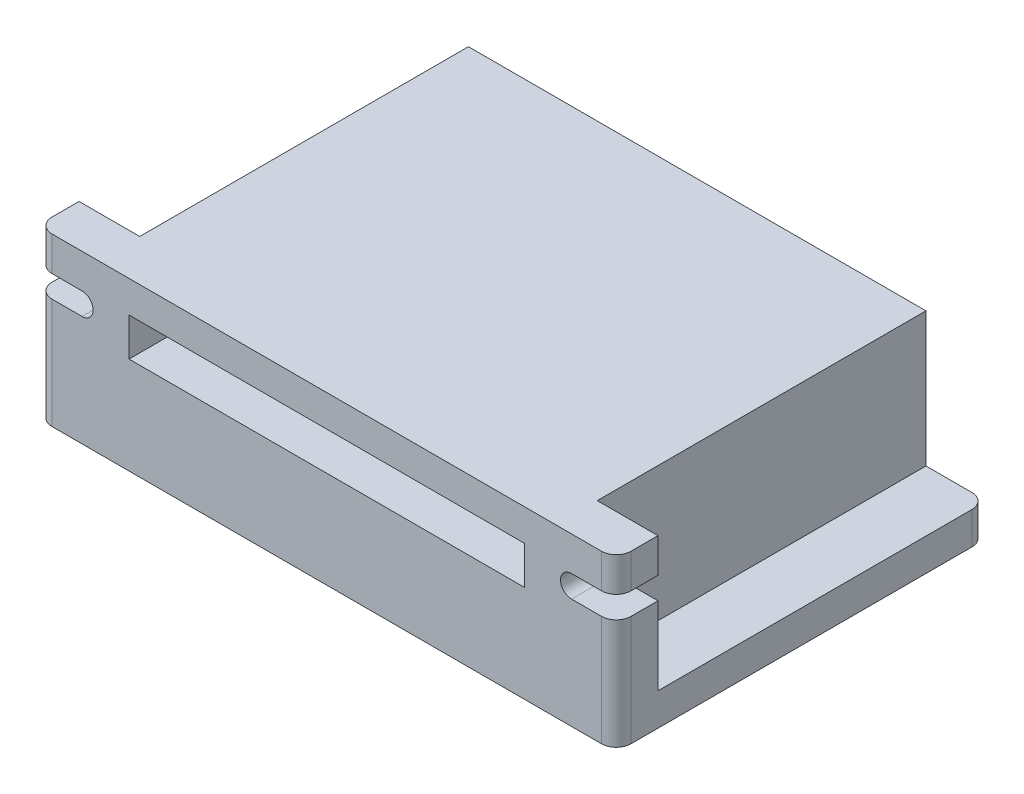
ISO-10303-21;
HEADER;
FILE_DESCRIPTION(('STEP AP214'),'2;1');
FILE_NAME('part.step','',(''),(''),'','','');
FILE_SCHEMA(('AUTOMOTIVE_DESIGN { 1 0 10303 214 1 1 1 1 }'));
ENDSEC;
DATA;
#1=APPLICATION_CONTEXT('core data for automotive mechanical design processes');
#2=APPLICATION_PROTOCOL_DEFINITION('international standard','automotive_design',2000,#1);
#3=PRODUCT_CONTEXT('',#1,'mechanical');
#4=PRODUCT('Part','Part','',(#3));
#5=PRODUCT_RELATED_PRODUCT_CATEGORY('part','',(#4));
#6=PRODUCT_DEFINITION_FORMATION('','',#4);
#7=PRODUCT_DEFINITION_CONTEXT('part definition',#1,'design');
#8=PRODUCT_DEFINITION('design','',#6,#7);
#9=PRODUCT_DEFINITION_SHAPE('','',#8);
#10=(LENGTH_UNIT() NAMED_UNIT(*) SI_UNIT(.MILLI.,.METRE.));
#11=(NAMED_UNIT(*) PLANE_ANGLE_UNIT() SI_UNIT($,.RADIAN.));
#12=(NAMED_UNIT(*) SI_UNIT($,.STERADIAN.) SOLID_ANGLE_UNIT());
#13=UNCERTAINTY_MEASURE_WITH_UNIT(LENGTH_MEASURE(1.E-05),#10,'distance_accuracy_value','');
#14=(GEOMETRIC_REPRESENTATION_CONTEXT(3) GLOBAL_UNCERTAINTY_ASSIGNED_CONTEXT((#13)) GLOBAL_UNIT_ASSIGNED_CONTEXT((#10,
#11,#12)) REPRESENTATION_CONTEXT('',''));
#15=CARTESIAN_POINT('',(0.,0.,0.));
#16=DIRECTION('',(0.,0.,1.));
#17=DIRECTION('',(1.,0.,0.));
#18=AXIS2_PLACEMENT_3D('',#15,#16,#17);
#19=CARTESIAN_POINT('',(-56.,34.,-34.75));
#20=DIRECTION('',(0.,-1.,0.));
#21=DIRECTION('',(0.,0.,-1.));
#22=AXIS2_PLACEMENT_3D('',#19,#20,#21);
#23=CYLINDRICAL_SURFACE('',#22,3.);
#24=CARTESIAN_POINT('',(-56.,6.61575280406623,-34.75));
#25=DIRECTION('',(0.,1.,0.));
#26=DIRECTION('',(0.,0.,1.));
#27=AXIS2_PLACEMENT_3D('',#24,#25,#26);
#28=CIRCLE('',#27,3.);
#29=CARTESIAN_POINT('',(-56.,6.61575280406623,-37.75));
#30=VERTEX_POINT('',#29);
#31=CARTESIAN_POINT('',(-59.,6.61575280406623,-34.75));
#32=VERTEX_POINT('',#31);
#33=EDGE_CURVE('E277',#30,#32,#28,.T.);
#34=ORIENTED_EDGE('',*,*,#33,.F.);
#35=DIRECTION('',(0.,-1.,0.));
#36=VECTOR('',#35,1.);
#37=CARTESIAN_POINT('',(-56.,34.,-37.75));
#38=LINE('',#37,#36);
#39=CARTESIAN_POINT('',(-56.,0.,-37.75));
#40=VERTEX_POINT('',#39);
#41=EDGE_CURVE('E361',#30,#40,#38,.T.);
#42=ORIENTED_EDGE('',*,*,#41,.T.);
#43=CARTESIAN_POINT('',(-56.,0.,-34.75));
#44=DIRECTION('',(0.,1.,0.));
#45=DIRECTION('',(0.,0.,-1.));
#46=AXIS2_PLACEMENT_3D('',#43,#44,#45);
#47=CIRCLE('',#46,3.);
#48=CARTESIAN_POINT('',(-59.,0.,-34.75));
#49=VERTEX_POINT('',#48);
#50=EDGE_CURVE('E345',#40,#49,#47,.T.);
#51=ORIENTED_EDGE('',*,*,#50,.T.);
#52=DIRECTION('',(0.,-1.,0.));
#53=VECTOR('',#52,1.);
#54=CARTESIAN_POINT('',(-59.,34.,-34.75));
#55=LINE('',#54,#53);
#56=EDGE_CURVE('E405',#32,#49,#55,.T.);
#57=ORIENTED_EDGE('',*,*,#56,.F.);
#58=EDGE_LOOP('',(#34,#42,#51,#57));
#59=FACE_BOUND('',#58,.T.);
#60=ADVANCED_FACE('F33',(#59),#23,.T.);
#61=CARTESIAN_POINT('',(-59.,34.,34.75));
#62=DIRECTION('',(1.,0.,0.));
#63=DIRECTION('',(0.,0.,-1.));
#64=AXIS2_PLACEMENT_3D('',#61,#62,#63);
#65=PLANE('',#64);
#66=DIRECTION('',(0.,0.,1.));
#67=VECTOR('',#66,1.);
#68=CARTESIAN_POINT('',(-59.,6.61575280406623,34.75));
#69=LINE('',#68,#67);
#70=CARTESIAN_POINT('',(-59.,6.61575280406623,29.25));
#71=VERTEX_POINT('',#70);
#72=EDGE_CURVE('E275',#32,#71,#69,.T.);
#73=ORIENTED_EDGE('',*,*,#72,.F.);
#74=ORIENTED_EDGE('',*,*,#56,.T.);
#75=DIRECTION('',(0.,0.,1.));
#76=VECTOR('',#75,1.);
#77=CARTESIAN_POINT('',(-59.,0.,34.75));
#78=LINE('',#77,#76);
#79=CARTESIAN_POINT('',(-59.,0.,34.75));
#80=VERTEX_POINT('',#79);
#81=EDGE_CURVE('E364',#49,#80,#78,.T.);
#82=ORIENTED_EDGE('',*,*,#81,.T.);
#83=DIRECTION('',(0.,-1.,0.));
#84=VECTOR('',#83,1.);
#85=CARTESIAN_POINT('',(-59.,34.,34.75));
#86=LINE('',#85,#84);
#87=CARTESIAN_POINT('',(-59.,22.5,34.75));
#88=VERTEX_POINT('',#87);
#89=EDGE_CURVE('E401',#88,#80,#86,.T.);
#90=ORIENTED_EDGE('',*,*,#89,.F.);
#91=DIRECTION('',(0.,0.,-1.));
#92=VECTOR('',#91,1.);
#93=CARTESIAN_POINT('',(-59.,22.5,34.75));
#94=LINE('',#93,#92);
#95=CARTESIAN_POINT('',(-59.,22.5,29.25));
#96=VERTEX_POINT('',#95);
#97=EDGE_CURVE('E337',#88,#96,#94,.T.);
#98=ORIENTED_EDGE('',*,*,#97,.T.);
#99=DIRECTION('',(0.,1.,0.));
#100=VECTOR('',#99,1.);
#101=CARTESIAN_POINT('',(-59.,34.,29.25));
#102=LINE('',#101,#100);
#103=EDGE_CURVE('E272',#71,#96,#102,.T.);
#104=ORIENTED_EDGE('',*,*,#103,.F.);
#105=EDGE_LOOP('',(#73,#74,#82,#90,#98,#104));
#106=FACE_BOUND('',#105,.T.);
#107=ADVANCED_FACE('F468',(#106),#65,.F.);
#108=CARTESIAN_POINT('',(-59.,27.,29.25));
#109=VERTEX_POINT('',#108);
#110=CARTESIAN_POINT('',(-59.,34.,29.25));
#111=VERTEX_POINT('',#110);
#112=EDGE_CURVE('E270',#109,#111,#102,.T.);
#113=ORIENTED_EDGE('',*,*,#112,.F.);
#114=DIRECTION('',(0.,0.,1.));
#115=VECTOR('',#114,1.);
#116=CARTESIAN_POINT('',(-59.,27.,34.75));
#117=LINE('',#116,#115);
#118=CARTESIAN_POINT('',(-59.,27.,34.75));
#119=VERTEX_POINT('',#118);
#120=EDGE_CURVE('E343',#109,#119,#117,.T.);
#121=ORIENTED_EDGE('',*,*,#120,.T.);
#122=CARTESIAN_POINT('',(-59.,34.,34.75));
#123=VERTEX_POINT('',#122);
#124=EDGE_CURVE('E402',#123,#119,#86,.T.);
#125=ORIENTED_EDGE('',*,*,#124,.F.);
#126=DIRECTION('',(0.,0.,1.));
#127=VECTOR('',#126,1.);
#128=CARTESIAN_POINT('',(-59.,34.,34.75));
#129=LINE('',#128,#127);
#130=EDGE_CURVE('E346',#111,#123,#129,.T.);
#131=ORIENTED_EDGE('',*,*,#130,.F.);
#132=EDGE_LOOP('',(#113,#121,#125,#131));
#133=FACE_BOUND('',#132,.T.);
#134=ADVANCED_FACE('F444',(#133),#65,.F.);
#135=CARTESIAN_POINT('',(-56.,34.,-37.75));
#136=DIRECTION('',(0.,0.,1.));
#137=DIRECTION('',(1.,0.,0.));
#138=AXIS2_PLACEMENT_3D('',#135,#136,#137);
#139=PLANE('',#138);
#140=DIRECTION('',(1.,0.,0.));
#141=VECTOR('',#140,1.);
#142=CARTESIAN_POINT('',(-66.0825163790406,6.61575280406623,-37.75));
#143=LINE('',#142,#141);
#144=CARTESIAN_POINT('',(-46.6299205781127,6.61575280406623,-37.75));
#145=VERTEX_POINT('',#144);
#146=EDGE_CURVE('E259',#30,#145,#143,.T.);
#147=ORIENTED_EDGE('',*,*,#146,.T.);
#148=DIRECTION('',(0.,1.,0.));
#149=VECTOR('',#148,1.);
#150=CARTESIAN_POINT('',(-46.6299205781127,6.61575280406623,-37.75));
#151=LINE('',#150,#149);
#152=CARTESIAN_POINT('',(-46.6299205781127,34.,-37.75));
#153=VERTEX_POINT('',#152);
#154=EDGE_CURVE('E251',#145,#153,#151,.T.);
#155=ORIENTED_EDGE('',*,*,#154,.T.);
#156=DIRECTION('',(-1.,0.,0.));
#157=VECTOR('',#156,1.);
#158=CARTESIAN_POINT('',(-56.,34.,-37.75));
#159=LINE('',#158,#157);
#160=CARTESIAN_POINT('',(46.6299205781127,34.,-37.75));
#161=VERTEX_POINT('',#160);
#162=EDGE_CURVE('E358',#161,#153,#159,.T.);
#163=ORIENTED_EDGE('',*,*,#162,.F.);
#164=DIRECTION('',(0.,1.,0.));
#165=VECTOR('',#164,1.);
#166=CARTESIAN_POINT('',(46.6299205781127,6.61575280406623,-37.75));
#167=LINE('',#166,#165);
#168=CARTESIAN_POINT('',(46.6299205781127,6.61575280406623,-37.75));
#169=VERTEX_POINT('',#168);
#170=EDGE_CURVE('E283',#169,#161,#167,.T.);
#171=ORIENTED_EDGE('',*,*,#170,.F.);
#172=DIRECTION('',(-1.,0.,0.));
#173=VECTOR('',#172,1.);
#174=CARTESIAN_POINT('',(66.0825163790406,6.61575280406623,-37.75));
#175=LINE('',#174,#173);
#176=CARTESIAN_POINT('',(56.,6.61575280406623,-37.75));
#177=VERTEX_POINT('',#176);
#178=EDGE_CURVE('E279',#177,#169,#175,.T.);
#179=ORIENTED_EDGE('',*,*,#178,.F.);
#180=DIRECTION('',(0.,-1.,0.));
#181=VECTOR('',#180,1.);
#182=CARTESIAN_POINT('',(56.,34.,-37.75));
#183=LINE('',#182,#181);
#184=CARTESIAN_POINT('',(56.,0.,-37.75));
#185=VERTEX_POINT('',#184);
#186=EDGE_CURVE('E385',#177,#185,#183,.T.);
#187=ORIENTED_EDGE('',*,*,#186,.T.);
#188=DIRECTION('',(-1.,0.,0.));
#189=VECTOR('',#188,1.);
#190=CARTESIAN_POINT('',(-56.,0.,-37.75));
#191=LINE('',#190,#189);
#192=EDGE_CURVE('E349',#185,#40,#191,.T.);
#193=ORIENTED_EDGE('',*,*,#192,.T.);
#194=ORIENTED_EDGE('',*,*,#41,.F.);
#195=EDGE_LOOP('',(#147,#155,#163,#171,#179,#187,#193,#194));
#196=FACE_BOUND('',#195,.T.);
#197=ADVANCED_FACE('F456',(#196),#139,.F.);
#198=CARTESIAN_POINT('',(-56.,34.,-34.75));
#199=DIRECTION('',(0.,-1.,0.));
#200=DIRECTION('',(0.,0.,-1.));
#201=AXIS2_PLACEMENT_3D('',#198,#199,#200);
#202=PLANE('',#201);
#203=DIRECTION('',(0.,0.,-1.));
#204=VECTOR('',#203,1.);
#205=CARTESIAN_POINT('',(-46.6299205781127,34.,-34.75));
#206=LINE('',#205,#204);
#207=CARTESIAN_POINT('',(-46.6299205781127,34.,29.25));
#208=VERTEX_POINT('',#207);
#209=EDGE_CURVE('E11',#208,#153,#206,.T.);
#210=ORIENTED_EDGE('',*,*,#209,.F.);
#211=DIRECTION('',(1.,0.,0.));
#212=VECTOR('',#211,1.);
#213=CARTESIAN_POINT('',(-56.,34.,29.25));
#214=LINE('',#213,#212);
#215=EDGE_CURVE('E273',#111,#208,#214,.T.);
#216=ORIENTED_EDGE('',*,*,#215,.F.);
#217=ORIENTED_EDGE('',*,*,#130,.T.);
#218=CARTESIAN_POINT('',(-56.,34.,34.75));
#219=DIRECTION('',(0.,1.,0.));
#220=DIRECTION('',(0.,0.,-1.));
#221=AXIS2_PLACEMENT_3D('',#218,#219,#220);
#222=CIRCLE('',#221,3.);
#223=CARTESIAN_POINT('',(-56.,34.,37.75));
#224=VERTEX_POINT('',#223);
#225=EDGE_CURVE('E348',#123,#224,#222,.T.);
#226=ORIENTED_EDGE('',*,*,#225,.T.);
#227=DIRECTION('',(1.,0.,0.));
#228=VECTOR('',#227,1.);
#229=CARTESIAN_POINT('',(-56.,34.,37.75));
#230=LINE('',#229,#228);
#231=CARTESIAN_POINT('',(56.,34.,37.75));
#232=VERTEX_POINT('',#231);
#233=EDGE_CURVE('E351',#224,#232,#230,.T.);
#234=ORIENTED_EDGE('',*,*,#233,.T.);
#235=CARTESIAN_POINT('',(56.,34.,34.75));
#236=DIRECTION('',(0.,1.,0.));
#237=DIRECTION('',(0.,0.,-1.));
#238=AXIS2_PLACEMENT_3D('',#235,#236,#237);
#239=CIRCLE('',#238,3.);
#240=CARTESIAN_POINT('',(59.,34.,34.75));
#241=VERTEX_POINT('',#240);
#242=EDGE_CURVE('E353',#232,#241,#239,.T.);
#243=ORIENTED_EDGE('',*,*,#242,.T.);
#244=DIRECTION('',(0.,0.,-1.));
#245=VECTOR('',#244,1.);
#246=CARTESIAN_POINT('',(59.,34.,34.75));
#247=LINE('',#246,#245);
#248=CARTESIAN_POINT('',(59.,34.,29.25));
#249=VERTEX_POINT('',#248);
#250=EDGE_CURVE('E355',#241,#249,#247,.T.);
#251=ORIENTED_EDGE('',*,*,#250,.T.);
#252=DIRECTION('',(1.,0.,0.));
#253=VECTOR('',#252,1.);
#254=CARTESIAN_POINT('',(-56.,34.,29.25));
#255=LINE('',#254,#253);
#256=CARTESIAN_POINT('',(46.6299205781127,34.,29.25));
#257=VERTEX_POINT('',#256);
#258=EDGE_CURVE('E300',#257,#249,#255,.T.);
#259=ORIENTED_EDGE('',*,*,#258,.F.);
#260=DIRECTION('',(0.,0.,-1.));
#261=VECTOR('',#260,1.);
#262=CARTESIAN_POINT('',(46.6299205781127,34.,-34.75));
#263=LINE('',#262,#261);
#264=EDGE_CURVE('E418',#257,#161,#263,.T.);
#265=ORIENTED_EDGE('',*,*,#264,.T.);
#266=ORIENTED_EDGE('',*,*,#162,.T.);
#267=EDGE_LOOP('',(#210,#216,#217,#226,#234,#243,#251,#259,#265,#266));
#268=FACE_BOUND('',#267,.T.);
#269=ADVANCED_FACE('F449',(#268),#202,.F.);
#270=CARTESIAN_POINT('',(-72.0827207811336,27.,3.74999999999999));
#271=DIRECTION('',(0.,1.,0.));
#272=DIRECTION('',(0.,0.,1.));
#273=AXIS2_PLACEMENT_3D('',#270,#271,#272);
#274=PLANE('',#273);
#275=DIRECTION('',(-1.,0.,0.));
#276=VECTOR('',#275,1.);
#277=CARTESIAN_POINT('',(-72.0827207811336,27.,29.25));
#278=LINE('',#277,#276);
#279=CARTESIAN_POINT('',(-49.8883465046181,27.,29.25));
#280=VERTEX_POINT('',#279);
#281=EDGE_CURVE('E268',#280,#109,#278,.T.);
#282=ORIENTED_EDGE('',*,*,#281,.F.);
#283=DIRECTION('',(0.,0.,1.));
#284=VECTOR('',#283,1.);
#285=CARTESIAN_POINT('',(-49.8883465046181,27.,3.74999999999999));
#286=LINE('',#285,#284);
#287=CARTESIAN_POINT('',(-49.8883465046181,27.,37.75));
#288=VERTEX_POINT('',#287);
#289=EDGE_CURVE('E331',#280,#288,#286,.T.);
#290=ORIENTED_EDGE('',*,*,#289,.T.);
#291=DIRECTION('',(-1.,0.,0.));
#292=VECTOR('',#291,1.);
#293=CARTESIAN_POINT('',(-72.0827207811336,27.,37.75));
#294=LINE('',#293,#292);
#295=CARTESIAN_POINT('',(-56.,27.,37.75));
#296=VERTEX_POINT('',#295);
#297=EDGE_CURVE('E328',#288,#296,#294,.T.);
#298=ORIENTED_EDGE('',*,*,#297,.T.);
#299=CARTESIAN_POINT('',(-56.,27.,34.75));
#300=DIRECTION('',(0.,1.,0.));
#301=DIRECTION('',(0.,0.,1.));
#302=AXIS2_PLACEMENT_3D('',#299,#300,#301);
#303=CIRCLE('',#302,3.);
#304=EDGE_CURVE('E340',#119,#296,#303,.T.);
#305=ORIENTED_EDGE('',*,*,#304,.F.);
#306=ORIENTED_EDGE('',*,*,#120,.F.);
#307=EDGE_LOOP('',(#282,#290,#298,#305,#306));
#308=FACE_BOUND('',#307,.T.);
#309=ADVANCED_FACE('F428',(#308),#274,.F.);
#310=CARTESIAN_POINT('',(-72.0827207811336,22.5,3.74999999999999));
#311=DIRECTION('',(0.,-1.,0.));
#312=DIRECTION('',(0.,0.,-1.));
#313=AXIS2_PLACEMENT_3D('',#310,#311,#312);
#314=PLANE('',#313);
#315=DIRECTION('',(1.,0.,0.));
#316=VECTOR('',#315,1.);
#317=CARTESIAN_POINT('',(-72.0827207811336,22.5,29.25));
#318=LINE('',#317,#316);
#319=CARTESIAN_POINT('',(-49.8883465046181,22.5,29.25));
#320=VERTEX_POINT('',#319);
#321=EDGE_CURVE('E55',#96,#320,#318,.T.);
#322=ORIENTED_EDGE('',*,*,#321,.F.);
#323=ORIENTED_EDGE('',*,*,#97,.F.);
#324=CARTESIAN_POINT('',(-56.,22.5,34.75));
#325=DIRECTION('',(0.,-1.,0.));
#326=DIRECTION('',(0.,0.,-1.));
#327=AXIS2_PLACEMENT_3D('',#324,#325,#326);
#328=CIRCLE('',#327,3.);
#329=CARTESIAN_POINT('',(-56.,22.5,37.75));
#330=VERTEX_POINT('',#329);
#331=EDGE_CURVE('E333',#330,#88,#328,.T.);
#332=ORIENTED_EDGE('',*,*,#331,.F.);
#333=DIRECTION('',(-1.,0.,0.));
#334=VECTOR('',#333,1.);
#335=CARTESIAN_POINT('',(-56.,22.5,37.75));
#336=LINE('',#335,#334);
#337=CARTESIAN_POINT('',(-49.8883465046181,22.5,37.75));
#338=VERTEX_POINT('',#337);
#339=EDGE_CURVE('E407',#338,#330,#336,.T.);
#340=ORIENTED_EDGE('',*,*,#339,.F.);
#341=DIRECTION('',(0.,0.,1.));
#342=VECTOR('',#341,1.);
#343=CARTESIAN_POINT('',(-49.8883465046181,22.5,3.74999999999999));
#344=LINE('',#343,#342);
#345=EDGE_CURVE('E330',#320,#338,#344,.T.);
#346=ORIENTED_EDGE('',*,*,#345,.F.);
#347=EDGE_LOOP('',(#322,#323,#332,#340,#346));
#348=FACE_BOUND('',#347,.T.);
#349=ADVANCED_FACE('F481',(#348),#314,.F.);
#350=CARTESIAN_POINT('',(-49.8883465046181,24.75,3.74999999999999));
#351=DIRECTION('',(0.,0.,1.));
#352=DIRECTION('',(1.,0.,0.));
#353=AXIS2_PLACEMENT_3D('',#350,#351,#352);
#354=CYLINDRICAL_SURFACE('',#353,2.25);
#355=CARTESIAN_POINT('',(-49.8883465046181,24.75,29.25));
#356=DIRECTION('',(0.,0.,-1.));
#357=DIRECTION('',(-1.,0.,0.));
#358=AXIS2_PLACEMENT_3D('',#355,#356,#357);
#359=CIRCLE('',#358,2.25);
#360=EDGE_CURVE('E40',#320,#280,#359,.F.);
#361=ORIENTED_EDGE('',*,*,#360,.F.);
#362=ORIENTED_EDGE('',*,*,#345,.T.);
#363=CARTESIAN_POINT('',(-49.8883465046181,24.75,37.75));
#364=DIRECTION('',(0.,0.,1.));
#365=DIRECTION('',(1.,0.,0.));
#366=AXIS2_PLACEMENT_3D('',#363,#364,#365);
#367=CIRCLE('',#366,2.25);
#368=EDGE_CURVE('E325',#338,#288,#367,.T.);
#369=ORIENTED_EDGE('',*,*,#368,.T.);
#370=ORIENTED_EDGE('',*,*,#289,.F.);
#371=EDGE_LOOP('',(#361,#362,#369,#370));
#372=FACE_BOUND('',#371,.T.);
#373=ADVANCED_FACE('F430',(#372),#354,.F.);
#374=CARTESIAN_POINT('',(59.,34.,34.75));
#375=DIRECTION('',(-1.,0.,0.));
#376=DIRECTION('',(0.,0.,1.));
#377=AXIS2_PLACEMENT_3D('',#374,#375,#376);
#378=PLANE('',#377);
#379=DIRECTION('',(0.,-1.,0.));
#380=VECTOR('',#379,1.);
#381=CARTESIAN_POINT('',(59.,34.,29.25));
#382=LINE('',#381,#380);
#383=CARTESIAN_POINT('',(59.,27.,29.25));
#384=VERTEX_POINT('',#383);
#385=EDGE_CURVE('E299',#249,#384,#382,.T.);
#386=ORIENTED_EDGE('',*,*,#385,.F.);
#387=ORIENTED_EDGE('',*,*,#250,.F.);
#388=DIRECTION('',(0.,-1.,0.));
#389=VECTOR('',#388,1.);
#390=CARTESIAN_POINT('',(59.,34.,34.75));
#391=LINE('',#390,#389);
#392=CARTESIAN_POINT('',(59.,27.,34.75));
#393=VERTEX_POINT('',#392);
#394=EDGE_CURVE('E390',#241,#393,#391,.T.);
#395=ORIENTED_EDGE('',*,*,#394,.T.);
#396=DIRECTION('',(0.,0.,1.));
#397=VECTOR('',#396,1.);
#398=CARTESIAN_POINT('',(59.,27.,34.75));
#399=LINE('',#398,#397);
#400=EDGE_CURVE('E410',#384,#393,#399,.T.);
#401=ORIENTED_EDGE('',*,*,#400,.F.);
#402=EDGE_LOOP('',(#386,#387,#395,#401));
#403=FACE_BOUND('',#402,.T.);
#404=ADVANCED_FACE('F512',(#403),#378,.F.);
#405=CARTESIAN_POINT('',(72.0827207811336,22.5,3.74999999999999));
#406=DIRECTION('',(0.,1.,0.));
#407=DIRECTION('',(0.,0.,1.));
#408=AXIS2_PLACEMENT_3D('',#405,#406,#407);
#409=PLANE('',#408);
#410=DIRECTION('',(0.,0.,-1.));
#411=VECTOR('',#410,1.);
#412=CARTESIAN_POINT('',(59.,22.5,34.75));
#413=LINE('',#412,#411);
#414=CARTESIAN_POINT('',(59.,22.5,34.75));
#415=VERTEX_POINT('',#414);
#416=CARTESIAN_POINT('',(59.,22.5,29.25));
#417=VERTEX_POINT('',#416);
#418=EDGE_CURVE('E412',#415,#417,#413,.T.);
#419=ORIENTED_EDGE('',*,*,#418,.T.);
#420=DIRECTION('',(-1.,0.,0.));
#421=VECTOR('',#420,1.);
#422=CARTESIAN_POINT('',(72.0827207811336,22.5,29.25));
#423=LINE('',#422,#421);
#424=CARTESIAN_POINT('',(49.8883465046181,22.5,29.25));
#425=VERTEX_POINT('',#424);
#426=EDGE_CURVE('E294',#417,#425,#423,.T.);
#427=ORIENTED_EDGE('',*,*,#426,.T.);
#428=DIRECTION('',(0.,0.,1.));
#429=VECTOR('',#428,1.);
#430=CARTESIAN_POINT('',(49.8883465046181,22.5,3.74999999999999));
#431=LINE('',#430,#429);
#432=CARTESIAN_POINT('',(49.8883465046181,22.5,37.75));
#433=VERTEX_POINT('',#432);
#434=EDGE_CURVE('E318',#425,#433,#431,.T.);
#435=ORIENTED_EDGE('',*,*,#434,.T.);
#436=DIRECTION('',(-1.,0.,0.));
#437=VECTOR('',#436,1.);
#438=CARTESIAN_POINT('',(72.0827207811336,22.5,37.75));
#439=LINE('',#438,#437);
#440=CARTESIAN_POINT('',(56.,22.5,37.75));
#441=VERTEX_POINT('',#440);
#442=EDGE_CURVE('E314',#441,#433,#439,.T.);
#443=ORIENTED_EDGE('',*,*,#442,.F.);
#444=CARTESIAN_POINT('',(56.,22.5,34.75));
#445=DIRECTION('',(0.,1.,0.));
#446=DIRECTION('',(0.,0.,1.));
#447=AXIS2_PLACEMENT_3D('',#444,#445,#446);
#448=CIRCLE('',#447,3.);
#449=EDGE_CURVE('E323',#441,#415,#448,.T.);
#450=ORIENTED_EDGE('',*,*,#449,.T.);
#451=EDGE_LOOP('',(#419,#427,#435,#443,#450));
#452=FACE_BOUND('',#451,.T.);
#453=ADVANCED_FACE('F491',(#452),#409,.T.);
#454=CARTESIAN_POINT('',(72.0827207811336,27.,3.74999999999999));
#455=DIRECTION('',(0.,-1.,0.));
#456=DIRECTION('',(0.,0.,-1.));
#457=AXIS2_PLACEMENT_3D('',#454,#455,#456);
#458=PLANE('',#457);
#459=DIRECTION('',(0.,0.,1.));
#460=VECTOR('',#459,1.);
#461=CARTESIAN_POINT('',(49.8883465046181,27.,3.74999999999999));
#462=LINE('',#461,#460);
#463=CARTESIAN_POINT('',(49.8883465046181,27.,29.25));
#464=VERTEX_POINT('',#463);
#465=CARTESIAN_POINT('',(49.8883465046181,27.,37.75));
#466=VERTEX_POINT('',#465);
#467=EDGE_CURVE('E317',#464,#466,#462,.T.);
#468=ORIENTED_EDGE('',*,*,#467,.F.);
#469=DIRECTION('',(1.,0.,0.));
#470=VECTOR('',#469,1.);
#471=CARTESIAN_POINT('',(72.0827207811336,27.,29.25));
#472=LINE('',#471,#470);
#473=EDGE_CURVE('E291',#464,#384,#472,.T.);
#474=ORIENTED_EDGE('',*,*,#473,.T.);
#475=ORIENTED_EDGE('',*,*,#400,.T.);
#476=CARTESIAN_POINT('',(56.,27.,34.75));
#477=DIRECTION('',(0.,-1.,0.));
#478=DIRECTION('',(0.,0.,-1.));
#479=AXIS2_PLACEMENT_3D('',#476,#477,#478);
#480=CIRCLE('',#479,3.);
#481=CARTESIAN_POINT('',(56.,27.,37.75));
#482=VERTEX_POINT('',#481);
#483=EDGE_CURVE('E320',#393,#482,#480,.T.);
#484=ORIENTED_EDGE('',*,*,#483,.T.);
#485=DIRECTION('',(1.,0.,0.));
#486=VECTOR('',#485,1.);
#487=CARTESIAN_POINT('',(72.0827207811336,27.,37.75));
#488=LINE('',#487,#486);
#489=EDGE_CURVE('E308',#466,#482,#488,.T.);
#490=ORIENTED_EDGE('',*,*,#489,.F.);
#491=EDGE_LOOP('',(#468,#474,#475,#484,#490));
#492=FACE_BOUND('',#491,.T.);
#493=ADVANCED_FACE('F516',(#492),#458,.T.);
#494=CARTESIAN_POINT('',(49.8883465046181,24.75,3.74999999999999));
#495=DIRECTION('',(0.,0.,1.));
#496=DIRECTION('',(1.,0.,0.));
#497=AXIS2_PLACEMENT_3D('',#494,#495,#496);
#498=CYLINDRICAL_SURFACE('',#497,2.25);
#499=ORIENTED_EDGE('',*,*,#434,.F.);
#500=CARTESIAN_POINT('',(49.8883465046181,24.75,29.25));
#501=DIRECTION('',(0.,0.,-1.));
#502=DIRECTION('',(-1.,0.,0.));
#503=AXIS2_PLACEMENT_3D('',#500,#501,#502);
#504=CIRCLE('',#503,2.25);
#505=EDGE_CURVE('E415',#425,#464,#504,.T.);
#506=ORIENTED_EDGE('',*,*,#505,.T.);
#507=ORIENTED_EDGE('',*,*,#467,.T.);
#508=CARTESIAN_POINT('',(49.8883465046181,24.75,37.75));
#509=DIRECTION('',(0.,0.,-1.));
#510=DIRECTION('',(-1.,0.,0.));
#511=AXIS2_PLACEMENT_3D('',#508,#509,#510);
#512=CIRCLE('',#511,2.25);
#513=EDGE_CURVE('E311',#433,#466,#512,.T.);
#514=ORIENTED_EDGE('',*,*,#513,.F.);
#515=EDGE_LOOP('',(#499,#506,#507,#514));
#516=FACE_BOUND('',#515,.T.);
#517=ADVANCED_FACE('F522',(#516),#498,.F.);
#518=CARTESIAN_POINT('',(-56.,34.,37.75));
#519=DIRECTION('',(0.,0.,-1.));
#520=DIRECTION('',(-1.,0.,0.));
#521=AXIS2_PLACEMENT_3D('',#518,#519,#520);
#522=PLANE('',#521);
#523=DIRECTION('',(1.,0.,0.));
#524=VECTOR('',#523,1.);
#525=CARTESIAN_POINT('',(40.3097923050009,19.7632799896672,37.75));
#526=LINE('',#525,#524);
#527=CARTESIAN_POINT('',(-40.3097923050009,19.7632799896672,37.75));
#528=VERTEX_POINT('',#527);
#529=CARTESIAN_POINT('',(40.3097923050009,19.7632799896672,37.75));
#530=VERTEX_POINT('',#529);
#531=EDGE_CURVE('E245',#528,#530,#526,.T.);
#532=ORIENTED_EDGE('',*,*,#531,.F.);
#533=DIRECTION('',(0.,-1.,0.));
#534=VECTOR('',#533,1.);
#535=CARTESIAN_POINT('',(-40.3097923050009,27.5390254329038,37.75));
#536=LINE('',#535,#534);
#537=CARTESIAN_POINT('',(-40.3097923050009,27.5390254329038,37.75));
#538=VERTEX_POINT('',#537);
#539=EDGE_CURVE('E47',#538,#528,#536,.T.);
#540=ORIENTED_EDGE('',*,*,#539,.F.);
#541=DIRECTION('',(-1.,0.,0.));
#542=VECTOR('',#541,1.);
#543=CARTESIAN_POINT('',(40.3097923050009,27.5390254329038,37.75));
#544=LINE('',#543,#542);
#545=CARTESIAN_POINT('',(40.3097923050009,27.5390254329038,37.75));
#546=VERTEX_POINT('',#545);
#547=EDGE_CURVE('E236',#546,#538,#544,.T.);
#548=ORIENTED_EDGE('',*,*,#547,.F.);
#549=DIRECTION('',(0.,1.,0.));
#550=VECTOR('',#549,1.);
#551=CARTESIAN_POINT('',(40.3097923050009,27.5390254329038,37.75));
#552=LINE('',#551,#550);
#553=EDGE_CURVE('E239',#530,#546,#552,.T.);
#554=ORIENTED_EDGE('',*,*,#553,.F.);
#555=EDGE_LOOP('',(#532,#540,#548,#554));
#556=FACE_BOUND('',#555,.T.);
#557=ORIENTED_EDGE('',*,*,#442,.T.);
#558=ORIENTED_EDGE('',*,*,#513,.T.);
#559=ORIENTED_EDGE('',*,*,#489,.T.);
#560=DIRECTION('',(0.,-1.,0.));
#561=VECTOR('',#560,1.);
#562=CARTESIAN_POINT('',(56.,34.,37.75));
#563=LINE('',#562,#561);
#564=EDGE_CURVE('E394',#232,#482,#563,.T.);
#565=ORIENTED_EDGE('',*,*,#564,.F.);
#566=ORIENTED_EDGE('',*,*,#233,.F.);
#567=DIRECTION('',(0.,-1.,0.));
#568=VECTOR('',#567,1.);
#569=CARTESIAN_POINT('',(-56.,34.,37.75));
#570=LINE('',#569,#568);
#571=EDGE_CURVE('E398',#224,#296,#570,.T.);
#572=ORIENTED_EDGE('',*,*,#571,.T.);
#573=ORIENTED_EDGE('',*,*,#297,.F.);
#574=ORIENTED_EDGE('',*,*,#368,.F.);
#575=ORIENTED_EDGE('',*,*,#339,.T.);
#576=CARTESIAN_POINT('',(-56.,0.,37.75));
#577=VERTEX_POINT('',#576);
#578=EDGE_CURVE('E397',#330,#577,#570,.T.);
#579=ORIENTED_EDGE('',*,*,#578,.T.);
#580=DIRECTION('',(1.,0.,0.));
#581=VECTOR('',#580,1.);
#582=CARTESIAN_POINT('',(-56.,0.,37.75));
#583=LINE('',#582,#581);
#584=CARTESIAN_POINT('',(56.,0.,37.75));
#585=VERTEX_POINT('',#584);
#586=EDGE_CURVE('E370',#577,#585,#583,.T.);
#587=ORIENTED_EDGE('',*,*,#586,.T.);
#588=EDGE_CURVE('E393',#441,#585,#563,.T.);
#589=ORIENTED_EDGE('',*,*,#588,.F.);
#590=EDGE_LOOP('',(#557,#558,#559,#565,#566,#572,#573,#574,#575,#579,#587,#589));
#591=FACE_BOUND('',#590,.T.);
#592=ADVANCED_FACE('F435',(#556,#591),#522,.F.);
#593=CARTESIAN_POINT('',(56.,34.,34.75));
#594=DIRECTION('',(0.,-1.,0.));
#595=DIRECTION('',(0.,0.,-1.));
#596=AXIS2_PLACEMENT_3D('',#593,#594,#595);
#597=CYLINDRICAL_SURFACE('',#596,3.);
#598=ORIENTED_EDGE('',*,*,#449,.F.);
#599=ORIENTED_EDGE('',*,*,#588,.T.);
#600=CARTESIAN_POINT('',(56.,0.,34.75));
#601=DIRECTION('',(0.,1.,0.));
#602=DIRECTION('',(0.,0.,-1.));
#603=AXIS2_PLACEMENT_3D('',#600,#601,#602);
#604=CIRCLE('',#603,3.);
#605=CARTESIAN_POINT('',(59.,0.,34.75));
#606=VERTEX_POINT('',#605);
#607=EDGE_CURVE('E373',#585,#606,#604,.T.);
#608=ORIENTED_EDGE('',*,*,#607,.T.);
#609=EDGE_CURVE('E389',#415,#606,#391,.T.);
#610=ORIENTED_EDGE('',*,*,#609,.F.);
#611=EDGE_LOOP('',(#598,#599,#608,#610));
#612=FACE_BOUND('',#611,.T.);
#613=ADVANCED_FACE('F488',(#612),#597,.T.);
#614=ORIENTED_EDGE('',*,*,#483,.F.);
#615=ORIENTED_EDGE('',*,*,#394,.F.);
#616=ORIENTED_EDGE('',*,*,#242,.F.);
#617=ORIENTED_EDGE('',*,*,#564,.T.);
#618=EDGE_LOOP('',(#614,#615,#616,#617));
#619=FACE_BOUND('',#618,.T.);
#620=ADVANCED_FACE('F525',(#619),#597,.T.);
#621=DIRECTION('',(0.,-1.,0.));
#622=VECTOR('',#621,1.);
#623=CARTESIAN_POINT('',(59.,34.,-34.75));
#624=LINE('',#623,#622);
#625=CARTESIAN_POINT('',(59.,6.61575280406623,-34.75));
#626=VERTEX_POINT('',#625);
#627=CARTESIAN_POINT('',(59.,0.,-34.75));
#628=VERTEX_POINT('',#627);
#629=EDGE_CURVE('E387',#626,#628,#624,.T.);
#630=ORIENTED_EDGE('',*,*,#629,.F.);
#631=DIRECTION('',(0.,0.,1.));
#632=VECTOR('',#631,1.);
#633=CARTESIAN_POINT('',(59.,6.61575280406623,34.75));
#634=LINE('',#633,#632);
#635=CARTESIAN_POINT('',(59.,6.61575280406623,29.25));
#636=VERTEX_POINT('',#635);
#637=EDGE_CURVE('E305',#626,#636,#634,.T.);
#638=ORIENTED_EDGE('',*,*,#637,.T.);
#639=EDGE_CURVE('E297',#417,#636,#382,.T.);
#640=ORIENTED_EDGE('',*,*,#639,.F.);
#641=ORIENTED_EDGE('',*,*,#418,.F.);
#642=ORIENTED_EDGE('',*,*,#609,.T.);
#643=DIRECTION('',(0.,0.,-1.));
#644=VECTOR('',#643,1.);
#645=CARTESIAN_POINT('',(59.,0.,34.75));
#646=LINE('',#645,#644);
#647=EDGE_CURVE('E376',#606,#628,#646,.T.);
#648=ORIENTED_EDGE('',*,*,#647,.T.);
#649=EDGE_LOOP('',(#630,#638,#640,#641,#642,#648));
#650=FACE_BOUND('',#649,.T.);
#651=ADVANCED_FACE('F495',(#650),#378,.F.);
#652=CARTESIAN_POINT('',(-56.,34.,34.75));
#653=DIRECTION('',(0.,-1.,0.));
#654=DIRECTION('',(0.,0.,-1.));
#655=AXIS2_PLACEMENT_3D('',#652,#653,#654);
#656=CYLINDRICAL_SURFACE('',#655,3.);
#657=ORIENTED_EDGE('',*,*,#124,.T.);
#658=ORIENTED_EDGE('',*,*,#304,.T.);
#659=ORIENTED_EDGE('',*,*,#571,.F.);
#660=ORIENTED_EDGE('',*,*,#225,.F.);
#661=EDGE_LOOP('',(#657,#658,#659,#660));
#662=FACE_BOUND('',#661,.T.);
#663=ADVANCED_FACE('F439',(#662),#656,.T.);
#664=ORIENTED_EDGE('',*,*,#578,.F.);
#665=ORIENTED_EDGE('',*,*,#331,.T.);
#666=ORIENTED_EDGE('',*,*,#89,.T.);
#667=CARTESIAN_POINT('',(-56.,0.,34.75));
#668=DIRECTION('',(0.,1.,0.));
#669=DIRECTION('',(0.,0.,-1.));
#670=AXIS2_PLACEMENT_3D('',#667,#668,#669);
#671=CIRCLE('',#670,3.);
#672=EDGE_CURVE('E367',#80,#577,#671,.T.);
#673=ORIENTED_EDGE('',*,*,#672,.T.);
#674=EDGE_LOOP('',(#664,#665,#666,#673));
#675=FACE_BOUND('',#674,.T.);
#676=ADVANCED_FACE('F479',(#675),#656,.T.);
#677=CARTESIAN_POINT('',(56.,34.,-34.75));
#678=DIRECTION('',(0.,-1.,0.));
#679=DIRECTION('',(0.,0.,-1.));
#680=AXIS2_PLACEMENT_3D('',#677,#678,#679);
#681=CYLINDRICAL_SURFACE('',#680,3.);
#682=ORIENTED_EDGE('',*,*,#186,.F.);
#683=CARTESIAN_POINT('',(56.,6.61575280406623,-34.75));
#684=DIRECTION('',(0.,-1.,0.));
#685=DIRECTION('',(0.,0.,-1.));
#686=AXIS2_PLACEMENT_3D('',#683,#684,#685);
#687=CIRCLE('',#686,3.);
#688=EDGE_CURVE('E302',#177,#626,#687,.T.);
#689=ORIENTED_EDGE('',*,*,#688,.T.);
#690=ORIENTED_EDGE('',*,*,#629,.T.);
#691=CARTESIAN_POINT('',(56.,0.,-34.75));
#692=DIRECTION('',(0.,1.,0.));
#693=DIRECTION('',(0.,0.,-1.));
#694=AXIS2_PLACEMENT_3D('',#691,#692,#693);
#695=CIRCLE('',#694,3.);
#696=EDGE_CURVE('E379',#628,#185,#695,.T.);
#697=ORIENTED_EDGE('',*,*,#696,.T.);
#698=EDGE_LOOP('',(#682,#689,#690,#697));
#699=FACE_BOUND('',#698,.T.);
#700=ADVANCED_FACE('F543',(#699),#681,.T.);
#701=CARTESIAN_POINT('',(-56.,0.,-34.75));
#702=DIRECTION('',(0.,-1.,0.));
#703=DIRECTION('',(0.,0.,-1.));
#704=AXIS2_PLACEMENT_3D('',#701,#702,#703);
#705=PLANE('',#704);
#706=ORIENTED_EDGE('',*,*,#50,.F.);
#707=ORIENTED_EDGE('',*,*,#192,.F.);
#708=ORIENTED_EDGE('',*,*,#696,.F.);
#709=ORIENTED_EDGE('',*,*,#647,.F.);
#710=ORIENTED_EDGE('',*,*,#607,.F.);
#711=ORIENTED_EDGE('',*,*,#586,.F.);
#712=ORIENTED_EDGE('',*,*,#672,.F.);
#713=ORIENTED_EDGE('',*,*,#81,.F.);
#714=EDGE_LOOP('',(#706,#707,#708,#709,#710,#711,#712,#713));
#715=FACE_BOUND('',#714,.T.);
#716=ADVANCED_FACE('F473',(#715),#705,.T.);
#717=CARTESIAN_POINT('',(66.0825163790406,6.61575280406623,29.25));
#718=DIRECTION('',(0.,-1.,0.));
#719=DIRECTION('',(0.,0.,-1.));
#720=AXIS2_PLACEMENT_3D('',#717,#718,#719);
#721=PLANE('',#720);
#722=ORIENTED_EDGE('',*,*,#688,.F.);
#723=ORIENTED_EDGE('',*,*,#178,.T.);
#724=DIRECTION('',(0.,0.,-1.));
#725=VECTOR('',#724,1.);
#726=CARTESIAN_POINT('',(46.6299205781127,6.61575280406623,29.25));
#727=LINE('',#726,#725);
#728=CARTESIAN_POINT('',(46.6299205781127,6.61575280406623,29.25));
#729=VERTEX_POINT('',#728);
#730=EDGE_CURVE('E286',#729,#169,#727,.T.);
#731=ORIENTED_EDGE('',*,*,#730,.F.);
#732=DIRECTION('',(-1.,0.,0.));
#733=VECTOR('',#732,1.);
#734=CARTESIAN_POINT('',(66.0825163790406,6.61575280406623,29.25));
#735=LINE('',#734,#733);
#736=EDGE_CURVE('E280',#636,#729,#735,.T.);
#737=ORIENTED_EDGE('',*,*,#736,.F.);
#738=ORIENTED_EDGE('',*,*,#637,.F.);
#739=EDGE_LOOP('',(#722,#723,#731,#737,#738));
#740=FACE_BOUND('',#739,.T.);
#741=ADVANCED_FACE('F501',(#740),#721,.F.);
#742=CARTESIAN_POINT('',(46.6299205781127,6.61575280406623,29.25));
#743=DIRECTION('',(-1.,0.,0.));
#744=DIRECTION('',(0.,0.,1.));
#745=AXIS2_PLACEMENT_3D('',#742,#743,#744);
#746=PLANE('',#745);
#747=DIRECTION('',(0.,1.,0.));
#748=VECTOR('',#747,1.);
#749=CARTESIAN_POINT('',(46.6299205781127,6.61575280406623,29.25));
#750=LINE('',#749,#748);
#751=EDGE_CURVE('E282',#729,#257,#750,.T.);
#752=ORIENTED_EDGE('',*,*,#751,.F.);
#753=ORIENTED_EDGE('',*,*,#730,.T.);
#754=ORIENTED_EDGE('',*,*,#170,.T.);
#755=ORIENTED_EDGE('',*,*,#264,.F.);
#756=EDGE_LOOP('',(#752,#753,#754,#755));
#757=FACE_BOUND('',#756,.T.);
#758=ADVANCED_FACE('F505',(#757),#746,.F.);
#759=CARTESIAN_POINT('',(0.,0.,29.25));
#760=DIRECTION('',(0.,0.,-1.));
#761=DIRECTION('',(-1.,0.,0.));
#762=AXIS2_PLACEMENT_3D('',#759,#760,#761);
#763=PLANE('',#762);
#764=ORIENTED_EDGE('',*,*,#258,.T.);
#765=ORIENTED_EDGE('',*,*,#385,.T.);
#766=ORIENTED_EDGE('',*,*,#473,.F.);
#767=ORIENTED_EDGE('',*,*,#505,.F.);
#768=ORIENTED_EDGE('',*,*,#426,.F.);
#769=ORIENTED_EDGE('',*,*,#639,.T.);
#770=ORIENTED_EDGE('',*,*,#736,.T.);
#771=ORIENTED_EDGE('',*,*,#751,.T.);
#772=EDGE_LOOP('',(#764,#765,#766,#767,#768,#769,#770,#771));
#773=FACE_BOUND('',#772,.T.);
#774=ADVANCED_FACE('F498',(#773),#763,.T.);
#775=CARTESIAN_POINT('',(-66.0825163790406,6.61575280406623,29.25));
#776=DIRECTION('',(0.,1.,0.));
#777=DIRECTION('',(0.,0.,1.));
#778=AXIS2_PLACEMENT_3D('',#775,#776,#777);
#779=PLANE('',#778);
#780=ORIENTED_EDGE('',*,*,#33,.T.);
#781=ORIENTED_EDGE('',*,*,#72,.T.);
#782=DIRECTION('',(1.,0.,0.));
#783=VECTOR('',#782,1.);
#784=CARTESIAN_POINT('',(-66.0825163790406,6.61575280406623,29.25));
#785=LINE('',#784,#783);
#786=CARTESIAN_POINT('',(-46.6299205781127,6.61575280406623,29.25));
#787=VERTEX_POINT('',#786);
#788=EDGE_CURVE('E258',#71,#787,#785,.T.);
#789=ORIENTED_EDGE('',*,*,#788,.T.);
#790=DIRECTION('',(0.,0.,-1.));
#791=VECTOR('',#790,1.);
#792=CARTESIAN_POINT('',(-46.6299205781127,6.61575280406623,29.25));
#793=LINE('',#792,#791);
#794=EDGE_CURVE('E261',#787,#145,#793,.T.);
#795=ORIENTED_EDGE('',*,*,#794,.T.);
#796=ORIENTED_EDGE('',*,*,#146,.F.);
#797=EDGE_LOOP('',(#780,#781,#789,#795,#796));
#798=FACE_BOUND('',#797,.T.);
#799=ADVANCED_FACE('F461',(#798),#779,.T.);
#800=CARTESIAN_POINT('',(-46.6299205781127,6.61575280406623,29.25));
#801=DIRECTION('',(-1.,0.,0.));
#802=DIRECTION('',(0.,0.,1.));
#803=AXIS2_PLACEMENT_3D('',#800,#801,#802);
#804=PLANE('',#803);
#805=ORIENTED_EDGE('',*,*,#209,.T.);
#806=ORIENTED_EDGE('',*,*,#154,.F.);
#807=ORIENTED_EDGE('',*,*,#794,.F.);
#808=DIRECTION('',(0.,1.,0.));
#809=VECTOR('',#808,1.);
#810=CARTESIAN_POINT('',(-46.6299205781127,6.61575280406623,29.25));
#811=LINE('',#810,#809);
#812=EDGE_CURVE('E255',#787,#208,#811,.T.);
#813=ORIENTED_EDGE('',*,*,#812,.T.);
#814=EDGE_LOOP('',(#805,#806,#807,#813));
#815=FACE_BOUND('',#814,.T.);
#816=ADVANCED_FACE('F453',(#815),#804,.T.);
#817=CARTESIAN_POINT('',(0.,0.,29.25));
#818=DIRECTION('',(0.,0.,-1.));
#819=DIRECTION('',(1.,0.,0.));
#820=AXIS2_PLACEMENT_3D('',#817,#818,#819);
#821=PLANE('',#820);
#822=ORIENTED_EDGE('',*,*,#215,.T.);
#823=ORIENTED_EDGE('',*,*,#812,.F.);
#824=ORIENTED_EDGE('',*,*,#788,.F.);
#825=ORIENTED_EDGE('',*,*,#103,.T.);
#826=ORIENTED_EDGE('',*,*,#321,.T.);
#827=ORIENTED_EDGE('',*,*,#360,.T.);
#828=ORIENTED_EDGE('',*,*,#281,.T.);
#829=ORIENTED_EDGE('',*,*,#112,.T.);
#830=EDGE_LOOP('',(#822,#823,#824,#825,#826,#827,#828,#829));
#831=FACE_BOUND('',#830,.T.);
#832=ADVANCED_FACE('F421',(#831),#821,.T.);
#833=CARTESIAN_POINT('',(-40.3097923050009,27.5390254329038,27.75));
#834=DIRECTION('',(-1.,0.,0.));
#835=DIRECTION('',(0.,0.,1.));
#836=AXIS2_PLACEMENT_3D('',#833,#834,#835);
#837=PLANE('',#836);
#838=ORIENTED_EDGE('',*,*,#539,.T.);
#839=DIRECTION('',(0.,0.,1.));
#840=VECTOR('',#839,1.);
#841=CARTESIAN_POINT('',(-40.3097923050009,19.7632799896672,27.75));
#842=LINE('',#841,#840);
#843=CARTESIAN_POINT('',(-40.3097923050009,19.7632799896672,27.75));
#844=VERTEX_POINT('',#843);
#845=EDGE_CURVE('E214',#844,#528,#842,.T.);
#846=ORIENTED_EDGE('',*,*,#845,.F.);
#847=DIRECTION('',(0.,-1.,0.));
#848=VECTOR('',#847,1.);
#849=CARTESIAN_POINT('',(-40.3097923050009,27.5390254329038,27.75));
#850=LINE('',#849,#848);
#851=CARTESIAN_POINT('',(-40.3097923050009,27.5390254329038,27.75));
#852=VERTEX_POINT('',#851);
#853=EDGE_CURVE('E218',#852,#844,#850,.T.);
#854=ORIENTED_EDGE('',*,*,#853,.F.);
#855=DIRECTION('',(0.,0.,1.));
#856=VECTOR('',#855,1.);
#857=CARTESIAN_POINT('',(-40.3097923050009,27.5390254329038,27.75));
#858=LINE('',#857,#856);
#859=EDGE_CURVE('E249',#852,#538,#858,.T.);
#860=ORIENTED_EDGE('',*,*,#859,.T.);
#861=EDGE_LOOP('',(#838,#846,#854,#860));
#862=FACE_BOUND('',#861,.T.);
#863=ADVANCED_FACE('F216',(#862),#837,.F.);
#864=CARTESIAN_POINT('',(40.3097923050009,27.5390254329038,27.75));
#865=DIRECTION('',(0.,1.,0.));
#866=DIRECTION('',(0.,0.,1.));
#867=AXIS2_PLACEMENT_3D('',#864,#865,#866);
#868=PLANE('',#867);
#869=ORIENTED_EDGE('',*,*,#547,.T.);
#870=ORIENTED_EDGE('',*,*,#859,.F.);
#871=DIRECTION('',(-1.,0.,0.));
#872=VECTOR('',#871,1.);
#873=CARTESIAN_POINT('',(40.3097923050009,27.5390254329038,27.75));
#874=LINE('',#873,#872);
#875=CARTESIAN_POINT('',(40.3097923050009,27.5390254329038,27.75));
#876=VERTEX_POINT('',#875);
#877=EDGE_CURVE('E224',#876,#852,#874,.T.);
#878=ORIENTED_EDGE('',*,*,#877,.F.);
#879=DIRECTION('',(0.,0.,1.));
#880=VECTOR('',#879,1.);
#881=CARTESIAN_POINT('',(40.3097923050009,27.5390254329038,27.75));
#882=LINE('',#881,#880);
#883=EDGE_CURVE('E252',#876,#546,#882,.T.);
#884=ORIENTED_EDGE('',*,*,#883,.T.);
#885=EDGE_LOOP('',(#869,#870,#878,#884));
#886=FACE_BOUND('',#885,.T.);
#887=ADVANCED_FACE('F555',(#886),#868,.F.);
#888=CARTESIAN_POINT('',(40.3097923050009,27.5390254329038,27.75));
#889=DIRECTION('',(1.,0.,0.));
#890=DIRECTION('',(0.,0.,-1.));
#891=AXIS2_PLACEMENT_3D('',#888,#889,#890);
#892=PLANE('',#891);
#893=ORIENTED_EDGE('',*,*,#553,.T.);
#894=ORIENTED_EDGE('',*,*,#883,.F.);
#895=DIRECTION('',(0.,1.,0.));
#896=VECTOR('',#895,1.);
#897=CARTESIAN_POINT('',(40.3097923050009,27.5390254329038,27.75));
#898=LINE('',#897,#896);
#899=CARTESIAN_POINT('',(40.3097923050009,19.7632799896672,27.75));
#900=VERTEX_POINT('',#899);
#901=EDGE_CURVE('E232',#900,#876,#898,.T.);
#902=ORIENTED_EDGE('',*,*,#901,.F.);
#903=DIRECTION('',(0.,0.,1.));
#904=VECTOR('',#903,1.);
#905=CARTESIAN_POINT('',(40.3097923050009,19.7632799896672,27.75));
#906=LINE('',#905,#904);
#907=EDGE_CURVE('E223',#900,#530,#906,.T.);
#908=ORIENTED_EDGE('',*,*,#907,.T.);
#909=EDGE_LOOP('',(#893,#894,#902,#908));
#910=FACE_BOUND('',#909,.T.);
#911=ADVANCED_FACE('F553',(#910),#892,.F.);
#912=CARTESIAN_POINT('',(40.3097923050009,19.7632799896672,27.75));
#913=DIRECTION('',(0.,-1.,0.));
#914=DIRECTION('',(0.,0.,-1.));
#915=AXIS2_PLACEMENT_3D('',#912,#913,#914);
#916=PLANE('',#915);
#917=ORIENTED_EDGE('',*,*,#531,.T.);
#918=ORIENTED_EDGE('',*,*,#907,.F.);
#919=DIRECTION('',(1.,0.,0.));
#920=VECTOR('',#919,1.);
#921=CARTESIAN_POINT('',(40.3097923050009,19.7632799896672,27.75));
#922=LINE('',#921,#920);
#923=EDGE_CURVE('E227',#844,#900,#922,.T.);
#924=ORIENTED_EDGE('',*,*,#923,.F.);
#925=ORIENTED_EDGE('',*,*,#845,.T.);
#926=EDGE_LOOP('',(#917,#918,#924,#925));
#927=FACE_BOUND('',#926,.T.);
#928=ADVANCED_FACE('F228',(#927),#916,.F.);
#929=CARTESIAN_POINT('',(0.,0.,27.75));
#930=DIRECTION('',(0.,0.,-1.));
#931=DIRECTION('',(-1.,0.,0.));
#932=AXIS2_PLACEMENT_3D('',#929,#930,#931);
#933=PLANE('',#932);
#934=ORIENTED_EDGE('',*,*,#853,.T.);
#935=ORIENTED_EDGE('',*,*,#923,.T.);
#936=ORIENTED_EDGE('',*,*,#901,.T.);
#937=ORIENTED_EDGE('',*,*,#877,.T.);
#938=EDGE_LOOP('',(#934,#935,#936,#937));
#939=FACE_BOUND('',#938,.T.);
#940=ADVANCED_FACE('F234',(#939),#933,.F.);
#941=CLOSED_SHELL('',(#60,#107,#134,#197,#269,#309,#349,#373,#404,#453,#493,#517,#592,#613,#620,
#651,#663,#676,#700,#716,#741,#758,#774,#799,#816,#832,#863,#887,#911,#928,#940));
#942=MANIFOLD_SOLID_BREP('B2',#941);
#943=ADVANCED_BREP_SHAPE_REPRESENTATION('',(#18,#942),#14);
#944=SHAPE_DEFINITION_REPRESENTATION(#9,#943);
ENDSEC;
END-ISO-10303-21;
